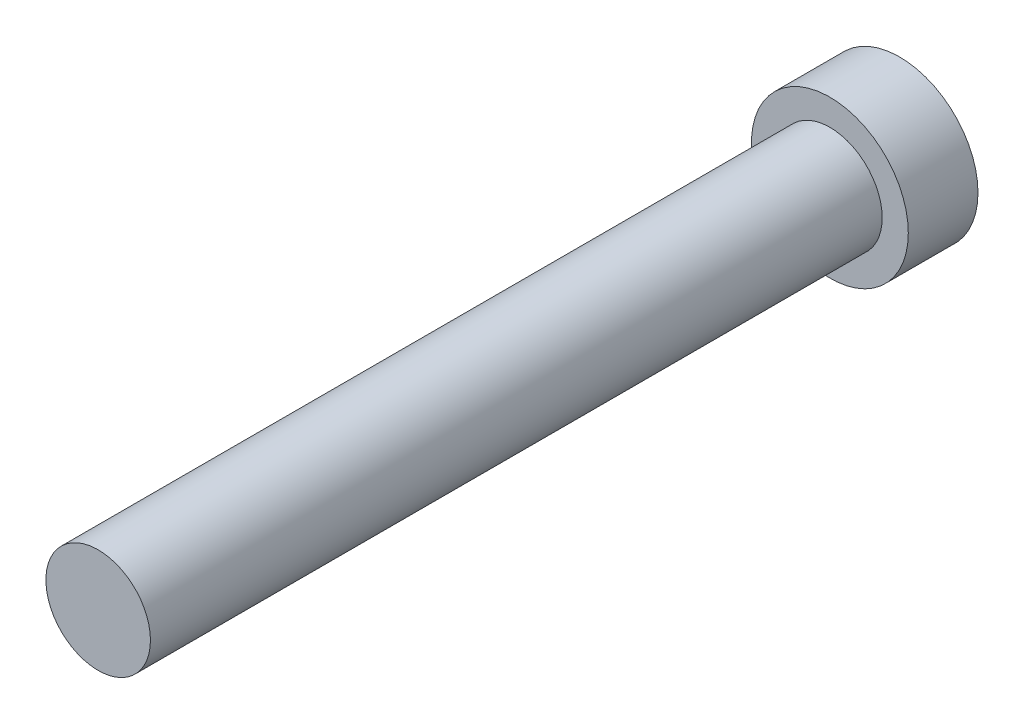
ISO-10303-21;
HEADER;
FILE_DESCRIPTION(('STEP AP214'),'2;1');
FILE_NAME('part.step','',(''),(''),'','','');
FILE_SCHEMA(('AUTOMOTIVE_DESIGN { 1 0 10303 214 1 1 1 1 }'));
ENDSEC;
DATA;
#1=APPLICATION_CONTEXT('core data for automotive mechanical design processes');
#2=APPLICATION_PROTOCOL_DEFINITION('international standard','automotive_design',2000,#1);
#3=PRODUCT_CONTEXT('',#1,'mechanical');
#4=PRODUCT('Part','Part','',(#3));
#5=PRODUCT_RELATED_PRODUCT_CATEGORY('part','',(#4));
#6=PRODUCT_DEFINITION_FORMATION('','',#4);
#7=PRODUCT_DEFINITION_CONTEXT('part definition',#1,'design');
#8=PRODUCT_DEFINITION('design','',#6,#7);
#9=PRODUCT_DEFINITION_SHAPE('','',#8);
#10=(LENGTH_UNIT() NAMED_UNIT(*) SI_UNIT(.MILLI.,.METRE.));
#11=(NAMED_UNIT(*) PLANE_ANGLE_UNIT() SI_UNIT($,.RADIAN.));
#12=(NAMED_UNIT(*) SI_UNIT($,.STERADIAN.) SOLID_ANGLE_UNIT());
#13=UNCERTAINTY_MEASURE_WITH_UNIT(LENGTH_MEASURE(1.E-05),#10,'distance_accuracy_value','');
#14=(GEOMETRIC_REPRESENTATION_CONTEXT(3) GLOBAL_UNCERTAINTY_ASSIGNED_CONTEXT((#13)) GLOBAL_UNIT_ASSIGNED_CONTEXT((#10,
#11,#12)) REPRESENTATION_CONTEXT('',''));
#15=CARTESIAN_POINT('',(0.,0.,0.));
#16=DIRECTION('',(0.,0.,1.));
#17=DIRECTION('',(1.,0.,0.));
#18=AXIS2_PLACEMENT_3D('',#15,#16,#17);
#19=CARTESIAN_POINT('',(0.,0.,20.));
#20=DIRECTION('',(0.,0.,-1.));
#21=DIRECTION('',(-1.,0.,0.));
#22=AXIS2_PLACEMENT_3D('',#19,#20,#21);
#23=CYLINDRICAL_SURFACE('',#22,22.5);
#24=CARTESIAN_POINT('',(0.,0.,20.));
#25=DIRECTION('',(0.,0.,1.));
#26=DIRECTION('',(1.,0.,0.));
#27=AXIS2_PLACEMENT_3D('',#24,#25,#26);
#28=CIRCLE('',#27,22.5);
#29=CARTESIAN_POINT('',(22.5,0.,20.));
#30=VERTEX_POINT('',#29);
#31=EDGE_CURVE('E42',#30,#30,#28,.T.);
#32=ORIENTED_EDGE('',*,*,#31,.F.);
#33=EDGE_LOOP('',(#32));
#34=FACE_BOUND('',#33,.T.);
#35=CARTESIAN_POINT('',(0.,0.,0.));
#36=DIRECTION('',(0.,0.,1.));
#37=DIRECTION('',(1.,0.,0.));
#38=AXIS2_PLACEMENT_3D('',#35,#36,#37);
#39=CIRCLE('',#38,22.5);
#40=CARTESIAN_POINT('',(22.5,0.,0.));
#41=VERTEX_POINT('',#40);
#42=EDGE_CURVE('E38',#41,#41,#39,.T.);
#43=ORIENTED_EDGE('',*,*,#42,.T.);
#44=EDGE_LOOP('',(#43));
#45=FACE_BOUND('',#44,.T.);
#46=ADVANCED_FACE('F35',(#34,#45),#23,.T.);
#47=CARTESIAN_POINT('',(0.,0.,20.));
#48=DIRECTION('',(0.,0.,1.));
#49=DIRECTION('',(1.,0.,0.));
#50=AXIS2_PLACEMENT_3D('',#47,#48,#49);
#51=PLANE('',#50);
#52=CARTESIAN_POINT('',(0.,0.,20.));
#53=DIRECTION('',(0.,0.,1.));
#54=DIRECTION('',(1.,0.,0.));
#55=AXIS2_PLACEMENT_3D('',#52,#53,#54);
#56=CIRCLE('',#55,15.);
#57=CARTESIAN_POINT('',(15.,0.,20.));
#58=VERTEX_POINT('',#57);
#59=EDGE_CURVE('E10',#58,#58,#56,.T.);
#60=ORIENTED_EDGE('',*,*,#59,.F.);
#61=EDGE_LOOP('',(#60));
#62=FACE_BOUND('',#61,.T.);
#63=ORIENTED_EDGE('',*,*,#31,.T.);
#64=EDGE_LOOP('',(#63));
#65=FACE_BOUND('',#64,.T.);
#66=ADVANCED_FACE('F59',(#62,#65),#51,.T.);
#67=CARTESIAN_POINT('',(0.,0.,0.));
#68=DIRECTION('',(0.,0.,1.));
#69=DIRECTION('',(1.,0.,0.));
#70=AXIS2_PLACEMENT_3D('',#67,#68,#69);
#71=PLANE('',#70);
#72=ORIENTED_EDGE('',*,*,#42,.F.);
#73=EDGE_LOOP('',(#72));
#74=FACE_BOUND('',#73,.T.);
#75=ADVANCED_FACE('F56',(#74),#71,.F.);
#76=CARTESIAN_POINT('',(0.,0.,230.));
#77=DIRECTION('',(0.,0.,-1.));
#78=DIRECTION('',(-1.,0.,0.));
#79=AXIS2_PLACEMENT_3D('',#76,#77,#78);
#80=CYLINDRICAL_SURFACE('',#79,15.);
#81=CARTESIAN_POINT('',(0.,0.,230.));
#82=DIRECTION('',(0.,0.,1.));
#83=DIRECTION('',(1.,0.,0.));
#84=AXIS2_PLACEMENT_3D('',#81,#82,#83);
#85=CIRCLE('',#84,15.);
#86=CARTESIAN_POINT('',(15.,0.,230.));
#87=VERTEX_POINT('',#86);
#88=EDGE_CURVE('E48',#87,#87,#85,.T.);
#89=ORIENTED_EDGE('',*,*,#88,.F.);
#90=EDGE_LOOP('',(#89));
#91=FACE_BOUND('',#90,.T.);
#92=ORIENTED_EDGE('',*,*,#59,.T.);
#93=EDGE_LOOP('',(#92));
#94=FACE_BOUND('',#93,.T.);
#95=ADVANCED_FACE('F58',(#91,#94),#80,.T.);
#96=CARTESIAN_POINT('',(0.,0.,230.));
#97=DIRECTION('',(0.,0.,1.));
#98=DIRECTION('',(1.,0.,0.));
#99=AXIS2_PLACEMENT_3D('',#96,#97,#98);
#100=PLANE('',#99);
#101=ORIENTED_EDGE('',*,*,#88,.T.);
#102=EDGE_LOOP('',(#101));
#103=FACE_BOUND('',#102,.T.);
#104=ADVANCED_FACE('F64',(#103),#100,.T.);
#105=CLOSED_SHELL('',(#46,#66,#75,#95,#104));
#106=MANIFOLD_SOLID_BREP('B2',#105);
#107=ADVANCED_BREP_SHAPE_REPRESENTATION('',(#18,#106),#14);
#108=SHAPE_DEFINITION_REPRESENTATION(#9,#107);
ENDSEC;
END-ISO-10303-21;
